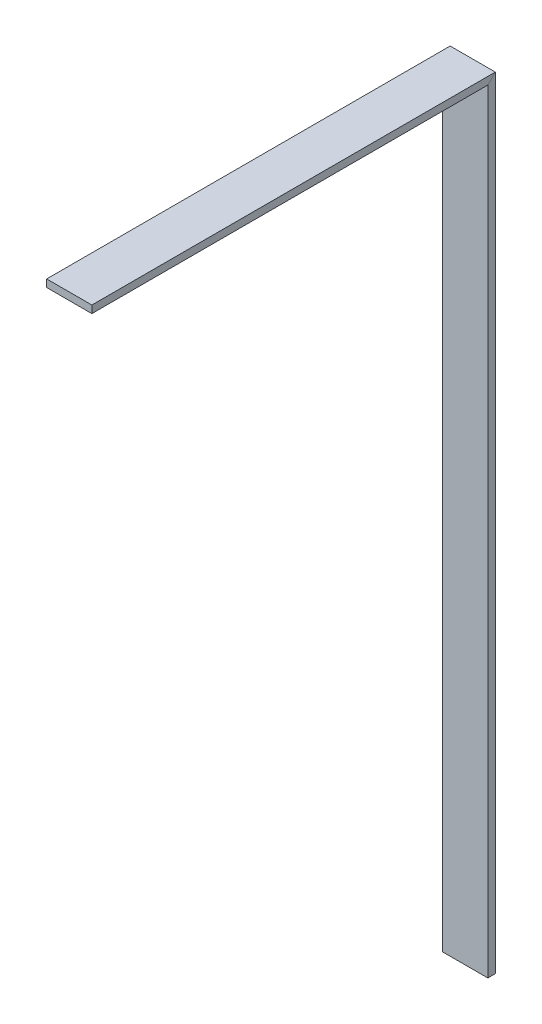
ISO-10303-21;
HEADER;
FILE_DESCRIPTION(('STEP AP214'),'2;1');
FILE_NAME('part.step','',(''),(''),'','','');
FILE_SCHEMA(('AUTOMOTIVE_DESIGN { 1 0 10303 214 1 1 1 1 }'));
ENDSEC;
DATA;
#1=APPLICATION_CONTEXT('core data for automotive mechanical design processes');
#2=APPLICATION_PROTOCOL_DEFINITION('international standard','automotive_design',2000,#1);
#3=PRODUCT_CONTEXT('',#1,'mechanical');
#4=PRODUCT('Part','Part','',(#3));
#5=PRODUCT_RELATED_PRODUCT_CATEGORY('part','',(#4));
#6=PRODUCT_DEFINITION_FORMATION('','',#4);
#7=PRODUCT_DEFINITION_CONTEXT('part definition',#1,'design');
#8=PRODUCT_DEFINITION('design','',#6,#7);
#9=PRODUCT_DEFINITION_SHAPE('','',#8);
#10=(LENGTH_UNIT() NAMED_UNIT(*) SI_UNIT(.MILLI.,.METRE.));
#11=(NAMED_UNIT(*) PLANE_ANGLE_UNIT() SI_UNIT($,.RADIAN.));
#12=(NAMED_UNIT(*) SI_UNIT($,.STERADIAN.) SOLID_ANGLE_UNIT());
#13=UNCERTAINTY_MEASURE_WITH_UNIT(LENGTH_MEASURE(1.E-05),#10,'distance_accuracy_value','');
#14=(GEOMETRIC_REPRESENTATION_CONTEXT(3) GLOBAL_UNCERTAINTY_ASSIGNED_CONTEXT((#13)) GLOBAL_UNIT_ASSIGNED_CONTEXT((#10,
#11,#12)) REPRESENTATION_CONTEXT('',''));
#15=CARTESIAN_POINT('',(0.,0.,0.));
#16=DIRECTION('',(0.,0.,1.));
#17=DIRECTION('',(1.,0.,0.));
#18=AXIS2_PLACEMENT_3D('',#15,#16,#17);
#19=CARTESIAN_POINT('',(19.05,425.25,6.31));
#20=DIRECTION('',(-1.,0.,0.));
#21=DIRECTION('',(0.,-1.,0.));
#22=AXIS2_PLACEMENT_3D('',#19,#20,#21);
#23=PLANE('',#22);
#24=DIRECTION('',(0.,0.,1.));
#25=VECTOR('',#24,1.);
#26=CARTESIAN_POINT('',(19.0500000000001,-268.786077720152,-571.69));
#27=LINE('',#26,#25);
#28=CARTESIAN_POINT('',(19.05,-268.786077720152,-202.8));
#29=VERTEX_POINT('',#28);
#30=CARTESIAN_POINT('',(19.05,-268.786077720152,-196.49));
#31=VERTEX_POINT('',#30);
#32=EDGE_CURVE('E43',#29,#31,#27,.T.);
#33=ORIENTED_EDGE('',*,*,#32,.F.);
#34=DIRECTION('',(0.,1.,0.));
#35=VECTOR('',#34,1.);
#36=CARTESIAN_POINT('',(19.0499999999999,-262.476077720152,-202.8));
#37=LINE('',#36,#35);
#38=CARTESIAN_POINT('',(19.0499999999999,390.008922279848,-202.8));
#39=VERTEX_POINT('',#38);
#40=EDGE_CURVE('E96',#29,#39,#37,.T.);
#41=ORIENTED_EDGE('',*,*,#40,.T.);
#42=DIRECTION('',(0.,-0.707106781186548,0.707106781186548));
#43=VECTOR('',#42,1.);
#44=CARTESIAN_POINT('',(19.0499999999999,60.6114222798484,126.5975));
#45=LINE('',#44,#43);
#46=CARTESIAN_POINT('',(19.0499999999999,383.698922279848,-196.49));
#47=VERTEX_POINT('',#46);
#48=EDGE_CURVE('E80',#39,#47,#45,.T.);
#49=ORIENTED_EDGE('',*,*,#48,.T.);
#50=DIRECTION('',(0.,1.,0.));
#51=VECTOR('',#50,1.);
#52=CARTESIAN_POINT('',(19.0499999999999,-262.476077720152,-196.49));
#53=LINE('',#52,#51);
#54=EDGE_CURVE('E105',#31,#47,#53,.T.);
#55=ORIENTED_EDGE('',*,*,#54,.F.);
#56=EDGE_LOOP('',(#33,#41,#49,#55));
#57=FACE_BOUND('',#56,.T.);
#58=ADVANCED_FACE('F35',(#57),#23,.F.);
#59=CARTESIAN_POINT('',(-19.0500000000001,425.25,6.31));
#60=DIRECTION('',(1.,0.,0.));
#61=DIRECTION('',(0.,1.,0.));
#62=AXIS2_PLACEMENT_3D('',#59,#60,#61);
#63=PLANE('',#62);
#64=DIRECTION('',(0.,1.,0.));
#65=VECTOR('',#64,1.);
#66=CARTESIAN_POINT('',(-19.0499999999999,-262.476077720152,-202.8));
#67=LINE('',#66,#65);
#68=CARTESIAN_POINT('',(-19.05,-268.786077720152,-202.8));
#69=VERTEX_POINT('',#68);
#70=CARTESIAN_POINT('',(-19.0499999999999,390.008922279848,-202.8));
#71=VERTEX_POINT('',#70);
#72=EDGE_CURVE('E104',#69,#71,#67,.T.);
#73=ORIENTED_EDGE('',*,*,#72,.F.);
#74=DIRECTION('',(0.,0.,1.));
#75=VECTOR('',#74,1.);
#76=CARTESIAN_POINT('',(-19.0499999999999,-268.786077720152,-571.69));
#77=LINE('',#76,#75);
#78=CARTESIAN_POINT('',(-19.0499999999999,-268.786077720152,-196.49));
#79=VERTEX_POINT('',#78);
#80=EDGE_CURVE('E111',#69,#79,#77,.T.);
#81=ORIENTED_EDGE('',*,*,#80,.T.);
#82=DIRECTION('',(0.,1.,0.));
#83=VECTOR('',#82,1.);
#84=CARTESIAN_POINT('',(-19.0499999999999,-262.476077720152,-196.49));
#85=LINE('',#84,#83);
#86=CARTESIAN_POINT('',(-19.0499999999999,383.698922279848,-196.49));
#87=VERTEX_POINT('',#86);
#88=EDGE_CURVE('E134',#79,#87,#85,.T.);
#89=ORIENTED_EDGE('',*,*,#88,.T.);
#90=DIRECTION('',(0.,0.707106781186548,-0.707106781186548));
#91=VECTOR('',#90,1.);
#92=CARTESIAN_POINT('',(-19.0499999999999,63.7664222798484,123.4425));
#93=LINE('',#92,#91);
#94=EDGE_CURVE('E141',#87,#71,#93,.T.);
#95=ORIENTED_EDGE('',*,*,#94,.T.);
#96=EDGE_LOOP('',(#73,#81,#89,#95));
#97=FACE_BOUND('',#96,.T.);
#98=ADVANCED_FACE('F145',(#97),#63,.F.);
#99=CARTESIAN_POINT('',(-19.0499999999999,-268.786077720152,-571.69));
#100=DIRECTION('',(0.,-1.,0.));
#101=DIRECTION('',(0.,0.,-1.));
#102=AXIS2_PLACEMENT_3D('',#99,#100,#101);
#103=PLANE('',#102);
#104=DIRECTION('',(1.,0.,0.));
#105=VECTOR('',#104,1.);
#106=CARTESIAN_POINT('',(-127.95,-268.786077720152,-202.8));
#107=LINE('',#106,#105);
#108=EDGE_CURVE('E100',#69,#29,#107,.T.);
#109=ORIENTED_EDGE('',*,*,#108,.T.);
#110=ORIENTED_EDGE('',*,*,#32,.T.);
#111=DIRECTION('',(1.,0.,0.));
#112=VECTOR('',#111,1.);
#113=CARTESIAN_POINT('',(-19.0499999999999,-268.786077720152,-196.49));
#114=LINE('',#113,#112);
#115=EDGE_CURVE('E11',#79,#31,#114,.T.);
#116=ORIENTED_EDGE('',*,*,#115,.F.);
#117=ORIENTED_EDGE('',*,*,#80,.F.);
#118=EDGE_LOOP('',(#109,#110,#116,#117));
#119=FACE_BOUND('',#118,.T.);
#120=ADVANCED_FACE('F108',(#119),#103,.T.);
#121=CARTESIAN_POINT('',(0.,187.208922279848,137.595));
#122=DIRECTION('',(0.,0.,1.));
#123=DIRECTION('',(0.,-1.,0.));
#124=AXIS2_PLACEMENT_3D('',#121,#122,#123);
#125=PLANE('',#124);
#126=DIRECTION('',(0.,1.,0.));
#127=VECTOR('',#126,1.);
#128=CARTESIAN_POINT('',(19.0499999999999,383.698922279848,137.595));
#129=LINE('',#128,#127);
#130=CARTESIAN_POINT('',(19.0499999999999,383.698922279848,137.595));
#131=VERTEX_POINT('',#130);
#132=CARTESIAN_POINT('',(19.0499999999999,390.008922279848,137.595));
#133=VERTEX_POINT('',#132);
#134=EDGE_CURVE('E69',#131,#133,#129,.T.);
#135=ORIENTED_EDGE('',*,*,#134,.T.);
#136=DIRECTION('',(-1.,0.,0.));
#137=VECTOR('',#136,1.);
#138=CARTESIAN_POINT('',(19.0499999999999,390.008922279848,137.595));
#139=LINE('',#138,#137);
#140=CARTESIAN_POINT('',(-19.0499999999999,390.008922279848,137.595));
#141=VERTEX_POINT('',#140);
#142=EDGE_CURVE('E127',#133,#141,#139,.T.);
#143=ORIENTED_EDGE('',*,*,#142,.T.);
#144=DIRECTION('',(0.,-1.,0.));
#145=VECTOR('',#144,1.);
#146=CARTESIAN_POINT('',(-19.0499999999999,390.008922279848,137.595));
#147=LINE('',#146,#145);
#148=CARTESIAN_POINT('',(-19.0499999999999,383.698922279848,137.595));
#149=VERTEX_POINT('',#148);
#150=EDGE_CURVE('E129',#141,#149,#147,.T.);
#151=ORIENTED_EDGE('',*,*,#150,.T.);
#152=DIRECTION('',(1.,0.,0.));
#153=VECTOR('',#152,1.);
#154=CARTESIAN_POINT('',(-19.0499999999999,383.698922279848,137.595));
#155=LINE('',#154,#153);
#156=EDGE_CURVE('E73',#149,#131,#155,.T.);
#157=ORIENTED_EDGE('',*,*,#156,.T.);
#158=EDGE_LOOP('',(#135,#143,#151,#157));
#159=FACE_BOUND('',#158,.T.);
#160=ADVANCED_FACE('F171',(#159),#125,.T.);
#161=CARTESIAN_POINT('',(19.0499999999999,383.698922279848,-203.2155));
#162=DIRECTION('',(1.,0.,0.));
#163=DIRECTION('',(0.,1.,0.));
#164=AXIS2_PLACEMENT_3D('',#161,#162,#163);
#165=PLANE('',#164);
#166=ORIENTED_EDGE('',*,*,#48,.F.);
#167=DIRECTION('',(0.,0.,1.));
#168=VECTOR('',#167,1.);
#169=CARTESIAN_POINT('',(19.0499999999999,390.008922279848,-203.2155));
#170=LINE('',#169,#168);
#171=EDGE_CURVE('E119',#39,#133,#170,.T.);
#172=ORIENTED_EDGE('',*,*,#171,.T.);
#173=ORIENTED_EDGE('',*,*,#134,.F.);
#174=DIRECTION('',(0.,0.,1.));
#175=VECTOR('',#174,1.);
#176=CARTESIAN_POINT('',(19.0499999999999,383.698922279848,-203.2155));
#177=LINE('',#176,#175);
#178=EDGE_CURVE('E116',#47,#131,#177,.T.);
#179=ORIENTED_EDGE('',*,*,#178,.F.);
#180=EDGE_LOOP('',(#166,#172,#173,#179));
#181=FACE_BOUND('',#180,.T.);
#182=ADVANCED_FACE('F175',(#181),#165,.T.);
#183=CARTESIAN_POINT('',(19.0499999999999,390.008922279848,-203.2155));
#184=DIRECTION('',(0.,1.,0.));
#185=DIRECTION('',(-1.,0.,0.));
#186=AXIS2_PLACEMENT_3D('',#183,#184,#185);
#187=PLANE('',#186);
#188=DIRECTION('',(1.,0.,0.));
#189=VECTOR('',#188,1.);
#190=CARTESIAN_POINT('',(19.05,390.008922279848,-202.8));
#191=LINE('',#190,#189);
#192=EDGE_CURVE('E51',#71,#39,#191,.T.);
#193=ORIENTED_EDGE('',*,*,#192,.F.);
#194=DIRECTION('',(0.,0.,1.));
#195=VECTOR('',#194,1.);
#196=CARTESIAN_POINT('',(-19.0499999999999,390.008922279848,-203.2155));
#197=LINE('',#196,#195);
#198=EDGE_CURVE('E121',#71,#141,#197,.T.);
#199=ORIENTED_EDGE('',*,*,#198,.T.);
#200=ORIENTED_EDGE('',*,*,#142,.F.);
#201=ORIENTED_EDGE('',*,*,#171,.F.);
#202=EDGE_LOOP('',(#193,#199,#200,#201));
#203=FACE_BOUND('',#202,.T.);
#204=ADVANCED_FACE('F179',(#203),#187,.T.);
#205=CARTESIAN_POINT('',(-19.0499999999999,390.008922279848,-203.2155));
#206=DIRECTION('',(-1.,0.,0.));
#207=DIRECTION('',(0.,-1.,0.));
#208=AXIS2_PLACEMENT_3D('',#205,#206,#207);
#209=PLANE('',#208);
#210=ORIENTED_EDGE('',*,*,#94,.F.);
#211=DIRECTION('',(0.,0.,1.));
#212=VECTOR('',#211,1.);
#213=CARTESIAN_POINT('',(-19.0499999999999,383.698922279848,-203.2155));
#214=LINE('',#213,#212);
#215=EDGE_CURVE('E123',#87,#149,#214,.T.);
#216=ORIENTED_EDGE('',*,*,#215,.T.);
#217=ORIENTED_EDGE('',*,*,#150,.F.);
#218=ORIENTED_EDGE('',*,*,#198,.F.);
#219=EDGE_LOOP('',(#210,#216,#217,#218));
#220=FACE_BOUND('',#219,.T.);
#221=ADVANCED_FACE('F149',(#220),#209,.T.);
#222=CARTESIAN_POINT('',(-19.0499999999999,383.698922279848,-203.2155));
#223=DIRECTION('',(0.,-1.,0.));
#224=DIRECTION('',(1.,0.,0.));
#225=AXIS2_PLACEMENT_3D('',#222,#223,#224);
#226=PLANE('',#225);
#227=DIRECTION('',(-1.,0.,0.));
#228=VECTOR('',#227,1.);
#229=CARTESIAN_POINT('',(-19.0499999999999,383.698922279848,-196.49));
#230=LINE('',#229,#228);
#231=EDGE_CURVE('E133',#47,#87,#230,.T.);
#232=ORIENTED_EDGE('',*,*,#231,.F.);
#233=ORIENTED_EDGE('',*,*,#178,.T.);
#234=ORIENTED_EDGE('',*,*,#156,.F.);
#235=ORIENTED_EDGE('',*,*,#215,.F.);
#236=EDGE_LOOP('',(#232,#233,#234,#235));
#237=FACE_BOUND('',#236,.T.);
#238=ADVANCED_FACE('F152',(#237),#226,.T.);
#239=CARTESIAN_POINT('',(-19.0499999999999,-262.476077720152,-196.49));
#240=DIRECTION('',(0.,0.,1.));
#241=DIRECTION('',(0.,-1.,0.));
#242=AXIS2_PLACEMENT_3D('',#239,#240,#241);
#243=PLANE('',#242);
#244=ORIENTED_EDGE('',*,*,#54,.T.);
#245=ORIENTED_EDGE('',*,*,#231,.T.);
#246=ORIENTED_EDGE('',*,*,#88,.F.);
#247=ORIENTED_EDGE('',*,*,#115,.T.);
#248=EDGE_LOOP('',(#244,#245,#246,#247));
#249=FACE_BOUND('',#248,.T.);
#250=ADVANCED_FACE('F154',(#249),#243,.T.);
#251=CARTESIAN_POINT('',(19.0499999999999,-262.476077720152,-202.8));
#252=DIRECTION('',(0.,0.,-1.));
#253=DIRECTION('',(0.,1.,0.));
#254=AXIS2_PLACEMENT_3D('',#251,#252,#253);
#255=PLANE('',#254);
#256=ORIENTED_EDGE('',*,*,#72,.T.);
#257=ORIENTED_EDGE('',*,*,#192,.T.);
#258=ORIENTED_EDGE('',*,*,#40,.F.);
#259=ORIENTED_EDGE('',*,*,#108,.F.);
#260=EDGE_LOOP('',(#256,#257,#258,#259));
#261=FACE_BOUND('',#260,.T.);
#262=ADVANCED_FACE('F99',(#261),#255,.T.);
#263=CLOSED_SHELL('',(#58,#98,#120,#160,#182,#204,#221,#238,#250,#262));
#264=MANIFOLD_SOLID_BREP('B2',#263);
#265=ADVANCED_BREP_SHAPE_REPRESENTATION('',(#18,#264),#14);
#266=SHAPE_DEFINITION_REPRESENTATION(#9,#265);
ENDSEC;
END-ISO-10303-21;
